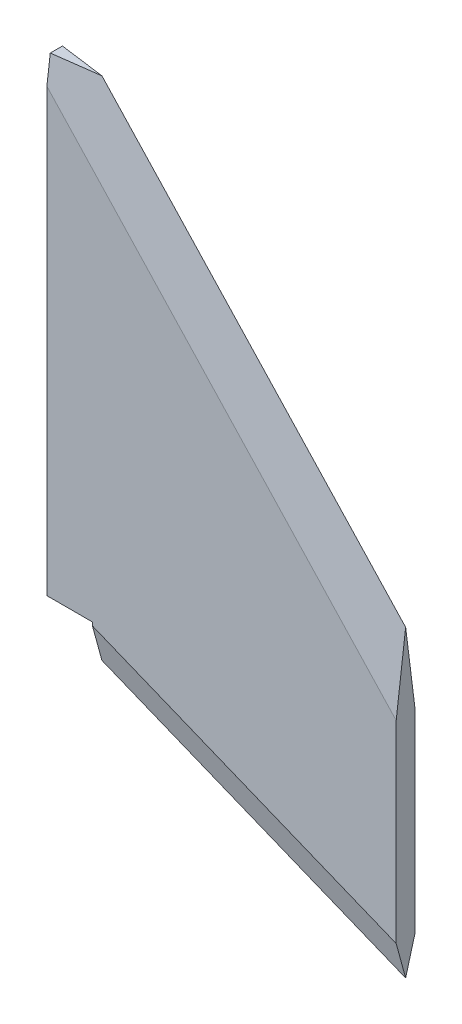
ISO-10303-21;
HEADER;
FILE_DESCRIPTION(('STEP AP214'),'2;1');
FILE_NAME('part.step','',(''),(''),'','','');
FILE_SCHEMA(('AUTOMOTIVE_DESIGN { 1 0 10303 214 1 1 1 1 }'));
ENDSEC;
DATA;
#1=APPLICATION_CONTEXT('core data for automotive mechanical design processes');
#2=APPLICATION_PROTOCOL_DEFINITION('international standard','automotive_design',2000,#1);
#3=PRODUCT_CONTEXT('',#1,'mechanical');
#4=PRODUCT('Part','Part','',(#3));
#5=PRODUCT_RELATED_PRODUCT_CATEGORY('part','',(#4));
#6=PRODUCT_DEFINITION_FORMATION('','',#4);
#7=PRODUCT_DEFINITION_CONTEXT('part definition',#1,'design');
#8=PRODUCT_DEFINITION('design','',#6,#7);
#9=PRODUCT_DEFINITION_SHAPE('','',#8);
#10=(LENGTH_UNIT() NAMED_UNIT(*) SI_UNIT(.MILLI.,.METRE.));
#11=(NAMED_UNIT(*) PLANE_ANGLE_UNIT() SI_UNIT($,.RADIAN.));
#12=(NAMED_UNIT(*) SI_UNIT($,.STERADIAN.) SOLID_ANGLE_UNIT());
#13=UNCERTAINTY_MEASURE_WITH_UNIT(LENGTH_MEASURE(1.E-05),#10,'distance_accuracy_value','');
#14=(GEOMETRIC_REPRESENTATION_CONTEXT(3) GLOBAL_UNCERTAINTY_ASSIGNED_CONTEXT((#13)) GLOBAL_UNIT_ASSIGNED_CONTEXT((#10,
#11,#12)) REPRESENTATION_CONTEXT('',''));
#15=CARTESIAN_POINT('',(0.,0.,0.));
#16=DIRECTION('',(0.,0.,1.));
#17=DIRECTION('',(1.,0.,0.));
#18=AXIS2_PLACEMENT_3D('',#15,#16,#17);
#19=CARTESIAN_POINT('',(76.2,0.,4.7498));
#20=DIRECTION('',(1.,0.,0.));
#21=DIRECTION('',(0.,0.,-1.));
#22=AXIS2_PLACEMENT_3D('',#19,#20,#21);
#23=PLANE('',#22);
#24=DIRECTION('',(0.,0.992319042336789,0.12370496439431));
#25=VECTOR('',#24,1.);
#26=CARTESIAN_POINT('',(76.2,0.984571975786659,-3.14810066152915));
#27=LINE('',#26,#25);
#28=CARTESIAN_POINT('',(76.2,26.2375620148194,0.));
#29=VERTEX_POINT('',#28);
#30=CARTESIAN_POINT('',(76.2,45.2882,2.3749));
#31=VERTEX_POINT('',#30);
#32=EDGE_CURVE('E149',#29,#31,#27,.T.);
#33=ORIENTED_EDGE('',*,*,#32,.T.);
#34=DIRECTION('',(0.,-0.992319042336789,0.123704964394309));
#35=VECTOR('',#34,1.);
#36=CARTESIAN_POINT('',(76.2,0.401511265694692,7.97058646247052));
#37=LINE('',#36,#35);
#38=CARTESIAN_POINT('',(76.2,26.2375620148194,4.7498));
#39=VERTEX_POINT('',#38);
#40=EDGE_CURVE('E135',#31,#39,#37,.T.);
#41=ORIENTED_EDGE('',*,*,#40,.T.);
#42=DIRECTION('',(0.,-1.,0.));
#43=VECTOR('',#42,1.);
#44=CARTESIAN_POINT('',(76.2,0.,4.7498));
#45=LINE('',#44,#43);
#46=CARTESIAN_POINT('',(76.2000000032941,-22.2370304556161,4.74980000258891));
#47=VERTEX_POINT('',#46);
#48=EDGE_CURVE('E172',#39,#47,#45,.T.);
#49=ORIENTED_EDGE('',*,*,#48,.T.);
#50=DIRECTION('',(0.,0.964507832956632,0.264054237165969));
#51=VECTOR('',#50,1.);
#52=CARTESIAN_POINT('',(76.2,-1.55046894742887,10.4131798442372));
#53=LINE('',#52,#51);
#54=CARTESIAN_POINT('',(76.2,-30.9118,2.3749));
#55=VERTEX_POINT('',#54);
#56=EDGE_CURVE('E168',#55,#47,#53,.T.);
#57=ORIENTED_EDGE('',*,*,#56,.F.);
#58=DIRECTION('',(0.,0.964507832956632,-0.264054237165968));
#59=VECTOR('',#58,1.);
#60=CARTESIAN_POINT('',(76.2,-2.76015931629467,-5.33220174837998));
#61=LINE('',#60,#59);
#62=CARTESIAN_POINT('',(76.2,-22.2370304542798,-2.58890114331405E-09));
#63=VERTEX_POINT('',#62);
#64=EDGE_CURVE('E163',#55,#63,#61,.T.);
#65=ORIENTED_EDGE('',*,*,#64,.T.);
#66=DIRECTION('',(0.,-1.,0.));
#67=VECTOR('',#66,1.);
#68=CARTESIAN_POINT('',(76.2,0.,0.));
#69=LINE('',#68,#67);
#70=EDGE_CURVE('E155',#29,#63,#69,.T.);
#71=ORIENTED_EDGE('',*,*,#70,.F.);
#72=EDGE_LOOP('',(#33,#41,#49,#57,#65,#71));
#73=FACE_BOUND('',#72,.T.);
#74=ADVANCED_FACE('F65',(#73),#23,.T.);
#75=CARTESIAN_POINT('',(0.,0.,0.));
#76=DIRECTION('',(0.,0.,1.));
#77=DIRECTION('',(1.,0.,0.));
#78=AXIS2_PLACEMENT_3D('',#75,#76,#77);
#79=PLANE('',#78);
#80=DIRECTION('',(-0.682010394219366,0.731342479401234,0.));
#81=VECTOR('',#80,1.);
#82=CARTESIAN_POINT('',(135.990118396751,-37.8773749459628,0.));
#83=LINE('',#82,#81);
#84=CARTESIAN_POINT('',(-11.43,120.206132014819,0.));
#85=VERTEX_POINT('',#84);
#86=EDGE_CURVE('E151',#29,#85,#83,.T.);
#87=ORIENTED_EDGE('',*,*,#86,.F.);
#88=ORIENTED_EDGE('',*,*,#70,.T.);
#89=DIRECTION('',(0.926654950689832,-0.375913024996508,0.));
#90=VECTOR('',#89,1.);
#91=CARTESIAN_POINT('',(-1.68562347688937,9.35857080284499,-2.58890114331405E-09));
#92=LINE('',#91,#90);
#93=CARTESIAN_POINT('',(0.,8.6747695457202,-2.58890101259048E-09));
#94=VERTEX_POINT('',#93);
#95=EDGE_CURVE('E145',#94,#63,#92,.T.);
#96=ORIENTED_EDGE('',*,*,#95,.F.);
#97=DIRECTION('',(0.,1.,0.));
#98=VECTOR('',#97,1.);
#99=CARTESIAN_POINT('',(0.,0.,0.));
#100=LINE('',#99,#98);
#101=CARTESIAN_POINT('',(0.,9.52500000000001,0.));
#102=VERTEX_POINT('',#101);
#103=EDGE_CURVE('E175',#94,#102,#100,.T.);
#104=ORIENTED_EDGE('',*,*,#103,.T.);
#105=DIRECTION('',(-1.,0.,0.));
#106=VECTOR('',#105,1.);
#107=CARTESIAN_POINT('',(0.,9.52500000000001,0.));
#108=LINE('',#107,#106);
#109=CARTESIAN_POINT('',(-11.43,9.52500000000001,0.));
#110=VERTEX_POINT('',#109);
#111=EDGE_CURVE('E171',#102,#110,#108,.T.);
#112=ORIENTED_EDGE('',*,*,#111,.T.);
#113=DIRECTION('',(0.,-1.,0.));
#114=VECTOR('',#113,1.);
#115=CARTESIAN_POINT('',(-11.43,127.,0.));
#116=LINE('',#115,#114);
#117=EDGE_CURVE('E185',#85,#110,#116,.T.);
#118=ORIENTED_EDGE('',*,*,#117,.F.);
#119=EDGE_LOOP('',(#87,#88,#96,#104,#112,#118));
#120=FACE_BOUND('',#119,.T.);
#121=ADVANCED_FACE('F212',(#120),#79,.F.);
#122=CARTESIAN_POINT('',(0.,0.,4.7498));
#123=DIRECTION('',(0.,0.,1.));
#124=DIRECTION('',(1.,0.,0.));
#125=AXIS2_PLACEMENT_3D('',#122,#123,#124);
#126=PLANE('',#125);
#127=ORIENTED_EDGE('',*,*,#48,.F.);
#128=DIRECTION('',(-0.682010394219366,0.731342479401234,0.));
#129=VECTOR('',#128,1.);
#130=CARTESIAN_POINT('',(135.990118396751,-37.8773749459628,4.7498));
#131=LINE('',#130,#129);
#132=CARTESIAN_POINT('',(-11.43,120.20613201482,4.7498));
#133=VERTEX_POINT('',#132);
#134=EDGE_CURVE('E141',#39,#133,#131,.T.);
#135=ORIENTED_EDGE('',*,*,#134,.T.);
#136=DIRECTION('',(0.,-1.,0.));
#137=VECTOR('',#136,1.);
#138=CARTESIAN_POINT('',(-11.43,127.,4.7498));
#139=LINE('',#138,#137);
#140=CARTESIAN_POINT('',(-11.43,9.52500000000001,4.7498));
#141=VERTEX_POINT('',#140);
#142=EDGE_CURVE('E184',#133,#141,#139,.T.);
#143=ORIENTED_EDGE('',*,*,#142,.T.);
#144=DIRECTION('',(-1.,0.,0.));
#145=VECTOR('',#144,1.);
#146=CARTESIAN_POINT('',(0.,9.52500000000001,4.7498));
#147=LINE('',#146,#145);
#148=CARTESIAN_POINT('',(0.,9.52500000000001,4.7498));
#149=VERTEX_POINT('',#148);
#150=EDGE_CURVE('E181',#149,#141,#147,.T.);
#151=ORIENTED_EDGE('',*,*,#150,.F.);
#152=DIRECTION('',(0.,1.,0.));
#153=VECTOR('',#152,1.);
#154=CARTESIAN_POINT('',(0.,0.,4.7498));
#155=LINE('',#154,#153);
#156=CARTESIAN_POINT('',(0.,8.6747695457202,4.74980000258891));
#157=VERTEX_POINT('',#156);
#158=EDGE_CURVE('E174',#157,#149,#155,.T.);
#159=ORIENTED_EDGE('',*,*,#158,.F.);
#160=DIRECTION('',(0.926654950689832,-0.375913024996508,0.));
#161=VECTOR('',#160,1.);
#162=CARTESIAN_POINT('',(-1.68562347688937,9.35857080284499,4.74980000258891));
#163=LINE('',#162,#161);
#164=EDGE_CURVE('E160',#157,#47,#163,.T.);
#165=ORIENTED_EDGE('',*,*,#164,.T.);
#166=EDGE_LOOP('',(#127,#135,#143,#151,#159,#165));
#167=FACE_BOUND('',#166,.T.);
#168=ADVANCED_FACE('F218',(#167),#126,.T.);
#169=CARTESIAN_POINT('',(-11.43,127.,4.7498));
#170=DIRECTION('',(1.,0.,0.));
#171=DIRECTION('',(0.,1.,0.));
#172=AXIS2_PLACEMENT_3D('',#169,#170,#171);
#173=PLANE('',#172);
#174=DIRECTION('',(0.,-0.992319042336789,0.123704964394309));
#175=VECTOR('',#174,1.);
#176=CARTESIAN_POINT('',(-11.43,126.896033993854,3.91582014996202));
#177=LINE('',#176,#175);
#178=CARTESIAN_POINT('',(-11.43,127.,3.90285948858214));
#179=VERTEX_POINT('',#178);
#180=EDGE_CURVE('E146',#179,#133,#177,.T.);
#181=ORIENTED_EDGE('',*,*,#180,.F.);
#182=DIRECTION('',(0.,0.,-1.));
#183=VECTOR('',#182,1.);
#184=CARTESIAN_POINT('',(-11.43,127.,4.7498));
#185=LINE('',#184,#183);
#186=CARTESIAN_POINT('',(-11.43,127.,0.84694051141785));
#187=VERTEX_POINT('',#186);
#188=EDGE_CURVE('E179',#179,#187,#185,.T.);
#189=ORIENTED_EDGE('',*,*,#188,.T.);
#190=DIRECTION('',(0.,0.992319042336789,0.12370496439431));
#191=VECTOR('',#190,1.);
#192=CARTESIAN_POINT('',(-11.43,127.479094703946,0.906665650979373));
#193=LINE('',#192,#191);
#194=EDGE_CURVE('E80',#85,#187,#193,.T.);
#195=ORIENTED_EDGE('',*,*,#194,.F.);
#196=ORIENTED_EDGE('',*,*,#117,.T.);
#197=DIRECTION('',(0.,0.,-1.));
#198=VECTOR('',#197,1.);
#199=CARTESIAN_POINT('',(-11.43,9.52500000000001,4.7498));
#200=LINE('',#199,#198);
#201=EDGE_CURVE('E187',#141,#110,#200,.T.);
#202=ORIENTED_EDGE('',*,*,#201,.F.);
#203=ORIENTED_EDGE('',*,*,#142,.F.);
#204=EDGE_LOOP('',(#181,#189,#195,#196,#202,#203));
#205=FACE_BOUND('',#204,.T.);
#206=ADVANCED_FACE('F223',(#205),#173,.F.);
#207=CARTESIAN_POINT('',(0.,127.,4.7498));
#208=DIRECTION('',(0.,-1.,0.));
#209=DIRECTION('',(0.,0.,-1.));
#210=AXIS2_PLACEMENT_3D('',#207,#208,#209);
#211=PLANE('',#210);
#212=DIRECTION('',(-0.991182861929786,0.,0.132501072511427));
#213=VECTOR('',#212,1.);
#214=CARTESIAN_POINT('',(-0.311902248339799,127.,2.4165950131112));
#215=LINE('',#214,#213);
#216=CARTESIAN_POINT('',(0.,127.,2.3749));
#217=VERTEX_POINT('',#216);
#218=EDGE_CURVE('E12',#217,#179,#215,.T.);
#219=ORIENTED_EDGE('',*,*,#218,.F.);
#220=DIRECTION('',(0.991182861929786,0.,0.132501072511428));
#221=VECTOR('',#220,1.);
#222=CARTESIAN_POINT('',(0.311902248339803,127.,2.41659501311118));
#223=LINE('',#222,#221);
#224=EDGE_CURVE('E73',#187,#217,#223,.T.);
#225=ORIENTED_EDGE('',*,*,#224,.F.);
#226=ORIENTED_EDGE('',*,*,#188,.F.);
#227=EDGE_LOOP('',(#219,#225,#226));
#228=FACE_BOUND('',#227,.T.);
#229=ADVANCED_FACE('F234',(#228),#211,.F.);
#230=CARTESIAN_POINT('',(0.,0.,4.7498));
#231=DIRECTION('',(-1.,0.,0.));
#232=DIRECTION('',(0.,0.,1.));
#233=AXIS2_PLACEMENT_3D('',#230,#231,#232);
#234=PLANE('',#233);
#235=DIRECTION('',(0.,-0.964507832956632,-0.264054237165969));
#236=VECTOR('',#235,1.);
#237=CARTESIAN_POINT('',(0.,0.604845184432911,2.54048904792858));
#238=LINE('',#237,#236);
#239=CARTESIAN_POINT('',(0.,0.,2.3749));
#240=VERTEX_POINT('',#239);
#241=EDGE_CURVE('E200',#157,#240,#238,.T.);
#242=ORIENTED_EDGE('',*,*,#241,.F.);
#243=ORIENTED_EDGE('',*,*,#158,.T.);
#244=DIRECTION('',(0.,0.,-1.));
#245=VECTOR('',#244,1.);
#246=CARTESIAN_POINT('',(0.,9.52500000000001,4.7498));
#247=LINE('',#246,#245);
#248=EDGE_CURVE('E177',#149,#102,#247,.T.);
#249=ORIENTED_EDGE('',*,*,#248,.T.);
#250=ORIENTED_EDGE('',*,*,#103,.F.);
#251=DIRECTION('',(0.,-0.964507832956632,0.264054237165968));
#252=VECTOR('',#251,1.);
#253=CARTESIAN_POINT('',(0.,-0.604845184432909,2.54048904792857));
#254=LINE('',#253,#252);
#255=EDGE_CURVE('E193',#94,#240,#254,.T.);
#256=ORIENTED_EDGE('',*,*,#255,.T.);
#257=EDGE_LOOP('',(#242,#243,#249,#250,#256));
#258=FACE_BOUND('',#257,.T.);
#259=ADVANCED_FACE('F208',(#258),#234,.T.);
#260=CARTESIAN_POINT('',(0.,9.52500000000001,4.7498));
#261=DIRECTION('',(0.,-1.,0.));
#262=DIRECTION('',(1.,0.,0.));
#263=AXIS2_PLACEMENT_3D('',#260,#261,#262);
#264=PLANE('',#263);
#265=ORIENTED_EDGE('',*,*,#111,.F.);
#266=ORIENTED_EDGE('',*,*,#248,.F.);
#267=ORIENTED_EDGE('',*,*,#150,.T.);
#268=ORIENTED_EDGE('',*,*,#201,.T.);
#269=EDGE_LOOP('',(#265,#266,#267,#268));
#270=FACE_BOUND('',#269,.T.);
#271=ADVANCED_FACE('F67',(#270),#264,.T.);
#272=CARTESIAN_POINT('',(-4.70740714950435,1.90963816698226,2.3749));
#273=DIRECTION('',(0.106508690531784,0.262552236314997,-0.959021491963136));
#274=DIRECTION('',(0.,0.964507832956632,0.264054237165969));
#275=AXIS2_PLACEMENT_3D('',#272,#273,#274);
#276=PLANE('',#275);
#277=ORIENTED_EDGE('',*,*,#56,.T.);
#278=ORIENTED_EDGE('',*,*,#164,.F.);
#279=ORIENTED_EDGE('',*,*,#241,.T.);
#280=DIRECTION('',(0.926654950689832,-0.375913024996508,0.));
#281=VECTOR('',#280,1.);
#282=CARTESIAN_POINT('',(-4.70740714950435,1.90963816698226,2.3749));
#283=LINE('',#282,#281);
#284=EDGE_CURVE('E88',#240,#55,#283,.T.);
#285=ORIENTED_EDGE('',*,*,#284,.T.);
#286=EDGE_LOOP('',(#277,#278,#279,#285));
#287=FACE_BOUND('',#286,.T.);
#288=ADVANCED_FACE('F203',(#287),#276,.F.);
#289=CARTESIAN_POINT('',(-4.70740714950435,1.90963816698226,2.3749));
#290=DIRECTION('',(-0.106508690531783,-0.262552236314996,-0.959021491963136));
#291=DIRECTION('',(0.,0.964507832956632,-0.264054237165968));
#292=AXIS2_PLACEMENT_3D('',#289,#290,#291);
#293=PLANE('',#292);
#294=ORIENTED_EDGE('',*,*,#284,.F.);
#295=ORIENTED_EDGE('',*,*,#255,.F.);
#296=ORIENTED_EDGE('',*,*,#95,.T.);
#297=ORIENTED_EDGE('',*,*,#64,.F.);
#298=EDGE_LOOP('',(#294,#295,#296,#297));
#299=FACE_BOUND('',#298,.T.);
#300=ADVANCED_FACE('F210',(#299),#293,.T.);
#301=CARTESIAN_POINT('',(145.492256052688,-29.0161959071654,2.3749));
#302=DIRECTION('',(0.131501003507722,0.122630715114444,0.983701780920916));
#303=DIRECTION('',(0.991182861929786,0.,-0.132501072511427));
#304=AXIS2_PLACEMENT_3D('',#301,#302,#303);
#305=PLANE('',#304);
#306=DIRECTION('',(-0.682010394219366,0.731342479401234,0.));
#307=VECTOR('',#306,1.);
#308=CARTESIAN_POINT('',(145.492256052688,-29.0161959071654,2.3749));
#309=LINE('',#308,#307);
#310=EDGE_CURVE('E138',#31,#217,#309,.T.);
#311=ORIENTED_EDGE('',*,*,#310,.T.);
#312=ORIENTED_EDGE('',*,*,#218,.T.);
#313=ORIENTED_EDGE('',*,*,#180,.T.);
#314=ORIENTED_EDGE('',*,*,#134,.F.);
#315=ORIENTED_EDGE('',*,*,#40,.F.);
#316=EDGE_LOOP('',(#311,#312,#313,#314,#315));
#317=FACE_BOUND('',#316,.T.);
#318=ADVANCED_FACE('F137',(#317),#305,.T.);
#319=CARTESIAN_POINT('',(145.492256052688,-29.0161959071654,2.3749));
#320=DIRECTION('',(0.131501003507722,0.122630715114444,-0.983701780920916));
#321=DIRECTION('',(-0.991182861929786,0.,-0.132501072511428));
#322=AXIS2_PLACEMENT_3D('',#319,#320,#321);
#323=PLANE('',#322);
#324=ORIENTED_EDGE('',*,*,#86,.T.);
#325=ORIENTED_EDGE('',*,*,#194,.T.);
#326=ORIENTED_EDGE('',*,*,#224,.T.);
#327=ORIENTED_EDGE('',*,*,#310,.F.);
#328=ORIENTED_EDGE('',*,*,#32,.F.);
#329=EDGE_LOOP('',(#324,#325,#326,#327,#328));
#330=FACE_BOUND('',#329,.T.);
#331=ADVANCED_FACE('F148',(#330),#323,.T.);
#332=CLOSED_SHELL('',(#74,#121,#168,#206,#229,#259,#271,#288,#300,#318,#331));
#333=MANIFOLD_SOLID_BREP('B2',#332);
#334=ADVANCED_BREP_SHAPE_REPRESENTATION('',(#18,#333),#14);
#335=SHAPE_DEFINITION_REPRESENTATION(#9,#334);
ENDSEC;
END-ISO-10303-21;
